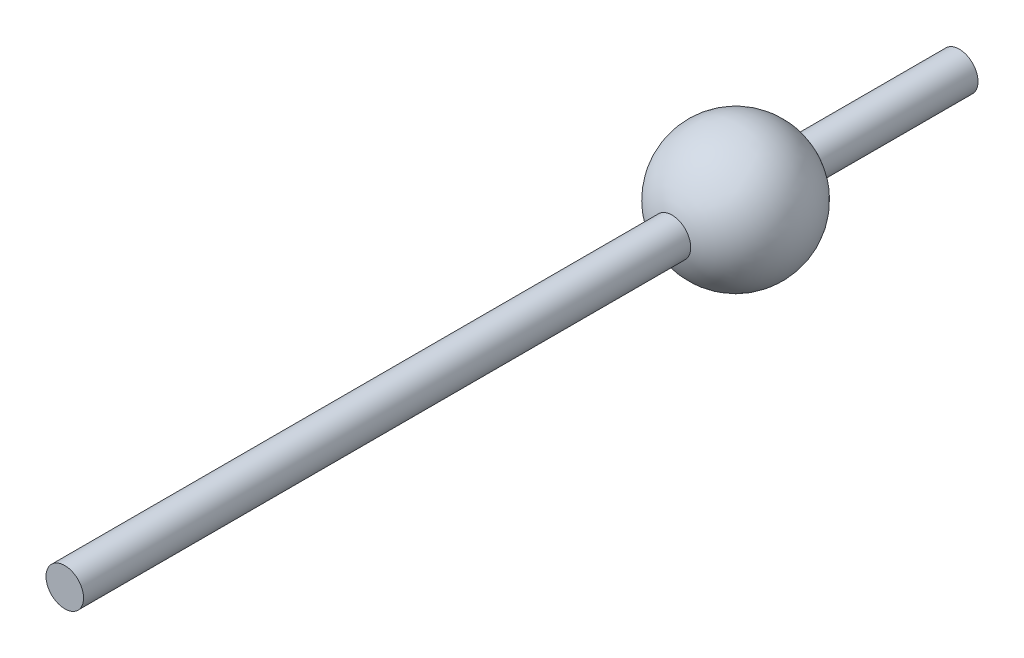
ISO-10303-21;
HEADER;
FILE_DESCRIPTION(('STEP AP214'),'2;1');
FILE_NAME('part.step','',(''),(''),'','','');
FILE_SCHEMA(('AUTOMOTIVE_DESIGN { 1 0 10303 214 1 1 1 1 }'));
ENDSEC;
DATA;
#1=APPLICATION_CONTEXT('core data for automotive mechanical design processes');
#2=APPLICATION_PROTOCOL_DEFINITION('international standard','automotive_design',2000,#1);
#3=PRODUCT_CONTEXT('',#1,'mechanical');
#4=PRODUCT('Part','Part','',(#3));
#5=PRODUCT_RELATED_PRODUCT_CATEGORY('part','',(#4));
#6=PRODUCT_DEFINITION_FORMATION('','',#4);
#7=PRODUCT_DEFINITION_CONTEXT('part definition',#1,'design');
#8=PRODUCT_DEFINITION('design','',#6,#7);
#9=PRODUCT_DEFINITION_SHAPE('','',#8);
#10=(LENGTH_UNIT() NAMED_UNIT(*) SI_UNIT(.MILLI.,.METRE.));
#11=(NAMED_UNIT(*) PLANE_ANGLE_UNIT() SI_UNIT($,.RADIAN.));
#12=(NAMED_UNIT(*) SI_UNIT($,.STERADIAN.) SOLID_ANGLE_UNIT());
#13=UNCERTAINTY_MEASURE_WITH_UNIT(LENGTH_MEASURE(1.E-05),#10,'distance_accuracy_value','');
#14=(GEOMETRIC_REPRESENTATION_CONTEXT(3) GLOBAL_UNCERTAINTY_ASSIGNED_CONTEXT((#13)) GLOBAL_UNIT_ASSIGNED_CONTEXT((#10,
#11,#12)) REPRESENTATION_CONTEXT('',''));
#15=CARTESIAN_POINT('',(0.,0.,0.));
#16=DIRECTION('',(0.,0.,1.));
#17=DIRECTION('',(1.,0.,0.));
#18=AXIS2_PLACEMENT_3D('',#15,#16,#17);
#19=CARTESIAN_POINT('',(0.,0.,100.));
#20=DIRECTION('',(0.,0.,-1.));
#21=DIRECTION('',(-1.,0.,0.));
#22=AXIS2_PLACEMENT_3D('',#19,#20,#21);
#23=CYLINDRICAL_SURFACE('',#22,4.2);
#24=CARTESIAN_POINT('',(0.,0.,-14.2436828102847));
#25=DIRECTION('',(0.,0.,1.));
#26=DIRECTION('',(1.,0.,0.));
#27=AXIS2_PLACEMENT_3D('',#24,#25,#26);
#28=CIRCLE('',#27,4.2);
#29=CARTESIAN_POINT('',(4.2,0.,-14.2436828102847));
#30=VERTEX_POINT('',#29);
#31=EDGE_CURVE('E10',#30,#30,#28,.F.);
#32=ORIENTED_EDGE('',*,*,#31,.T.);
#33=EDGE_LOOP('',(#32));
#34=FACE_BOUND('',#33,.T.);
#35=CARTESIAN_POINT('',(0.,0.,-50.));
#36=DIRECTION('',(0.,0.,-1.));
#37=DIRECTION('',(-1.,0.,0.));
#38=AXIS2_PLACEMENT_3D('',#35,#36,#37);
#39=CIRCLE('',#38,4.2);
#40=CARTESIAN_POINT('',(-4.2,0.,-50.));
#41=VERTEX_POINT('',#40);
#42=EDGE_CURVE('E42',#41,#41,#39,.T.);
#43=ORIENTED_EDGE('',*,*,#42,.F.);
#44=EDGE_LOOP('',(#43));
#45=FACE_BOUND('',#44,.T.);
#46=ADVANCED_FACE('F31',(#34,#45),#23,.T.);
#47=CARTESIAN_POINT('',(0.,0.,0.));
#48=DIRECTION('',(0.,1.,0.));
#49=DIRECTION('',(1.,0.,0.));
#50=AXIS2_PLACEMENT_3D('',#47,#48,#49);
#51=SPHERICAL_SURFACE('',#50,14.85);
#52=CARTESIAN_POINT('',(0.,0.,0.));
#53=DIRECTION('',(0.,0.,-1.));
#54=DIRECTION('',(-1.,0.,0.));
#55=AXIS2_PLACEMENT_3D('',#52,#53,#54);
#56=SPHERICAL_SURFACE('',#55,14.85);
#57=CARTESIAN_POINT('',(0.,0.,14.2436828102847));
#58=DIRECTION('',(0.,0.,-1.));
#59=DIRECTION('',(-1.,0.,0.));
#60=AXIS2_PLACEMENT_3D('',#57,#58,#59);
#61=CIRCLE('',#60,4.2);
#62=CARTESIAN_POINT('',(-4.2,0.,14.2436828102847));
#63=VERTEX_POINT('',#62);
#64=EDGE_CURVE('E38',#63,#63,#61,.F.);
#65=ORIENTED_EDGE('',*,*,#64,.F.);
#66=EDGE_LOOP('',(#65));
#67=FACE_BOUND('',#66,.T.);
#68=ORIENTED_EDGE('',*,*,#31,.F.);
#69=EDGE_LOOP('',(#68));
#70=FACE_BOUND('',#69,.T.);
#71=ADVANCED_FACE('F33',(#67,#70),#56,.T.);
#72=ORIENTED_EDGE('',*,*,#64,.T.);
#73=EDGE_LOOP('',(#72));
#74=FACE_BOUND('',#73,.T.);
#75=CARTESIAN_POINT('',(0.,0.,150.));
#76=DIRECTION('',(0.,0.,1.));
#77=DIRECTION('',(1.,0.,0.));
#78=AXIS2_PLACEMENT_3D('',#75,#76,#77);
#79=CIRCLE('',#78,4.2);
#80=CARTESIAN_POINT('',(4.2,0.,150.));
#81=VERTEX_POINT('',#80);
#82=EDGE_CURVE('E46',#81,#81,#79,.T.);
#83=ORIENTED_EDGE('',*,*,#82,.F.);
#84=EDGE_LOOP('',(#83));
#85=FACE_BOUND('',#84,.T.);
#86=ADVANCED_FACE('F54',(#74,#85),#23,.T.);
#87=CARTESIAN_POINT('',(0.,0.,-50.));
#88=DIRECTION('',(0.,0.,-1.));
#89=DIRECTION('',(-1.,0.,0.));
#90=AXIS2_PLACEMENT_3D('',#87,#88,#89);
#91=PLANE('',#90);
#92=ORIENTED_EDGE('',*,*,#42,.T.);
#93=EDGE_LOOP('',(#92));
#94=FACE_BOUND('',#93,.T.);
#95=ADVANCED_FACE('F56',(#94),#91,.T.);
#96=CARTESIAN_POINT('',(0.,0.,150.));
#97=DIRECTION('',(0.,0.,1.));
#98=DIRECTION('',(1.,0.,0.));
#99=AXIS2_PLACEMENT_3D('',#96,#97,#98);
#100=PLANE('',#99);
#101=ORIENTED_EDGE('',*,*,#82,.T.);
#102=EDGE_LOOP('',(#101));
#103=FACE_BOUND('',#102,.T.);
#104=ADVANCED_FACE('F52',(#103),#100,.T.);
#105=CLOSED_SHELL('',(#46,#71,#86,#95,#104));
#106=MANIFOLD_SOLID_BREP('B2',#105);
#107=ADVANCED_BREP_SHAPE_REPRESENTATION('',(#18,#106),#14);
#108=SHAPE_DEFINITION_REPRESENTATION(#9,#107);
ENDSEC;
END-ISO-10303-21;
